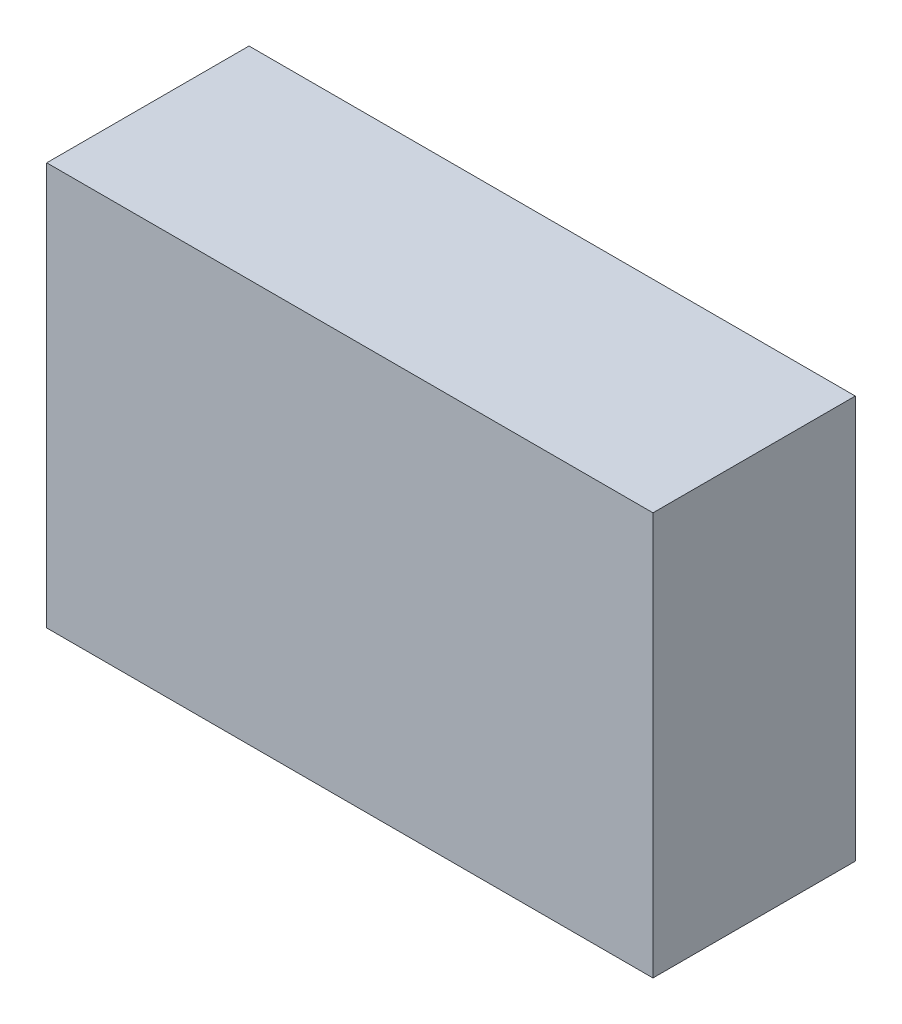
ISO-10303-21;
HEADER;
FILE_DESCRIPTION(('STEP AP214'),'2;1');
FILE_NAME('part.step','',(''),(''),'','','');
FILE_SCHEMA(('AUTOMOTIVE_DESIGN { 1 0 10303 214 1 1 1 1 }'));
ENDSEC;
DATA;
#1=APPLICATION_CONTEXT('core data for automotive mechanical design processes');
#2=APPLICATION_PROTOCOL_DEFINITION('international standard','automotive_design',2000,#1);
#3=PRODUCT_CONTEXT('',#1,'mechanical');
#4=PRODUCT('Part','Part','',(#3));
#5=PRODUCT_RELATED_PRODUCT_CATEGORY('part','',(#4));
#6=PRODUCT_DEFINITION_FORMATION('','',#4);
#7=PRODUCT_DEFINITION_CONTEXT('part definition',#1,'design');
#8=PRODUCT_DEFINITION('design','',#6,#7);
#9=PRODUCT_DEFINITION_SHAPE('','',#8);
#10=(LENGTH_UNIT() NAMED_UNIT(*) SI_UNIT(.MILLI.,.METRE.));
#11=(NAMED_UNIT(*) PLANE_ANGLE_UNIT() SI_UNIT($,.RADIAN.));
#12=(NAMED_UNIT(*) SI_UNIT($,.STERADIAN.) SOLID_ANGLE_UNIT());
#13=UNCERTAINTY_MEASURE_WITH_UNIT(LENGTH_MEASURE(1.E-05),#10,'distance_accuracy_value','');
#14=(GEOMETRIC_REPRESENTATION_CONTEXT(3) GLOBAL_UNCERTAINTY_ASSIGNED_CONTEXT((#13)) GLOBAL_UNIT_ASSIGNED_CONTEXT((#10,
#11,#12)) REPRESENTATION_CONTEXT('',''));
#15=CARTESIAN_POINT('',(0.,0.,0.));
#16=DIRECTION('',(0.,0.,1.));
#17=DIRECTION('',(1.,0.,0.));
#18=AXIS2_PLACEMENT_3D('',#15,#16,#17);
#19=CARTESIAN_POINT('',(-1.4984,-0.983,1.));
#20=DIRECTION('',(1.,0.,0.));
#21=DIRECTION('',(0.,0.,-1.));
#22=AXIS2_PLACEMENT_3D('',#19,#20,#21);
#23=PLANE('',#22);
#24=DIRECTION('',(0.,-1.,0.));
#25=VECTOR('',#24,1.);
#26=CARTESIAN_POINT('',(-1.4984,-0.983,0.));
#27=LINE('',#26,#25);
#28=CARTESIAN_POINT('',(-1.4984,1.0084,0.));
#29=VERTEX_POINT('',#28);
#30=CARTESIAN_POINT('',(-1.4984,-0.983,0.));
#31=VERTEX_POINT('',#30);
#32=EDGE_CURVE('E96',#29,#31,#27,.T.);
#33=ORIENTED_EDGE('',*,*,#32,.T.);
#34=DIRECTION('',(0.,0.,-1.));
#35=VECTOR('',#34,1.);
#36=CARTESIAN_POINT('',(-1.4984,-0.983,1.));
#37=LINE('',#36,#35);
#38=CARTESIAN_POINT('',(-1.4984,-0.983,1.));
#39=VERTEX_POINT('',#38);
#40=EDGE_CURVE('E11',#39,#31,#37,.T.);
#41=ORIENTED_EDGE('',*,*,#40,.F.);
#42=DIRECTION('',(0.,-1.,0.));
#43=VECTOR('',#42,1.);
#44=CARTESIAN_POINT('',(-1.4984,-0.983,1.));
#45=LINE('',#44,#43);
#46=CARTESIAN_POINT('',(-1.4984,1.0084,1.));
#47=VERTEX_POINT('',#46);
#48=EDGE_CURVE('E84',#47,#39,#45,.T.);
#49=ORIENTED_EDGE('',*,*,#48,.F.);
#50=DIRECTION('',(0.,0.,-1.));
#51=VECTOR('',#50,1.);
#52=CARTESIAN_POINT('',(-1.4984,1.0084,1.));
#53=LINE('',#52,#51);
#54=EDGE_CURVE('E92',#47,#29,#53,.T.);
#55=ORIENTED_EDGE('',*,*,#54,.T.);
#56=EDGE_LOOP('',(#33,#41,#49,#55));
#57=FACE_BOUND('',#56,.T.);
#58=ADVANCED_FACE('F33',(#57),#23,.F.);
#59=CARTESIAN_POINT('',(1.4984,-0.983,1.));
#60=DIRECTION('',(0.,1.,0.));
#61=DIRECTION('',(0.,0.,1.));
#62=AXIS2_PLACEMENT_3D('',#59,#60,#61);
#63=PLANE('',#62);
#64=DIRECTION('',(1.,0.,0.));
#65=VECTOR('',#64,1.);
#66=CARTESIAN_POINT('',(1.4984,-0.983,0.));
#67=LINE('',#66,#65);
#68=CARTESIAN_POINT('',(1.4984,-0.983,0.));
#69=VERTEX_POINT('',#68);
#70=EDGE_CURVE('E88',#31,#69,#67,.T.);
#71=ORIENTED_EDGE('',*,*,#70,.T.);
#72=DIRECTION('',(0.,0.,-1.));
#73=VECTOR('',#72,1.);
#74=CARTESIAN_POINT('',(1.4984,-0.983,1.));
#75=LINE('',#74,#73);
#76=CARTESIAN_POINT('',(1.4984,-0.983,1.));
#77=VERTEX_POINT('',#76);
#78=EDGE_CURVE('E41',#77,#69,#75,.T.);
#79=ORIENTED_EDGE('',*,*,#78,.F.);
#80=DIRECTION('',(1.,0.,0.));
#81=VECTOR('',#80,1.);
#82=CARTESIAN_POINT('',(1.4984,-0.983,1.));
#83=LINE('',#82,#81);
#84=EDGE_CURVE('E79',#39,#77,#83,.T.);
#85=ORIENTED_EDGE('',*,*,#84,.F.);
#86=ORIENTED_EDGE('',*,*,#40,.T.);
#87=EDGE_LOOP('',(#71,#79,#85,#86));
#88=FACE_BOUND('',#87,.T.);
#89=ADVANCED_FACE('F87',(#88),#63,.F.);
#90=CARTESIAN_POINT('',(1.4984,1.0084,1.));
#91=DIRECTION('',(-1.,0.,0.));
#92=DIRECTION('',(0.,0.,1.));
#93=AXIS2_PLACEMENT_3D('',#90,#91,#92);
#94=PLANE('',#93);
#95=DIRECTION('',(0.,1.,0.));
#96=VECTOR('',#95,1.);
#97=CARTESIAN_POINT('',(1.4984,1.0084,0.));
#98=LINE('',#97,#96);
#99=CARTESIAN_POINT('',(1.4984,1.0084,0.));
#100=VERTEX_POINT('',#99);
#101=EDGE_CURVE('E66',#69,#100,#98,.T.);
#102=ORIENTED_EDGE('',*,*,#101,.T.);
#103=DIRECTION('',(0.,0.,-1.));
#104=VECTOR('',#103,1.);
#105=CARTESIAN_POINT('',(1.4984,1.0084,1.));
#106=LINE('',#105,#104);
#107=CARTESIAN_POINT('',(1.4984,1.0084,1.));
#108=VERTEX_POINT('',#107);
#109=EDGE_CURVE('E89',#108,#100,#106,.T.);
#110=ORIENTED_EDGE('',*,*,#109,.F.);
#111=DIRECTION('',(0.,1.,0.));
#112=VECTOR('',#111,1.);
#113=CARTESIAN_POINT('',(1.4984,1.0084,1.));
#114=LINE('',#113,#112);
#115=EDGE_CURVE('E82',#77,#108,#114,.T.);
#116=ORIENTED_EDGE('',*,*,#115,.F.);
#117=ORIENTED_EDGE('',*,*,#78,.T.);
#118=EDGE_LOOP('',(#102,#110,#116,#117));
#119=FACE_BOUND('',#118,.T.);
#120=ADVANCED_FACE('F90',(#119),#94,.F.);
#121=CARTESIAN_POINT('',(-1.4984,1.0084,1.));
#122=DIRECTION('',(0.,-1.,0.));
#123=DIRECTION('',(0.,0.,-1.));
#124=AXIS2_PLACEMENT_3D('',#121,#122,#123);
#125=PLANE('',#124);
#126=DIRECTION('',(-1.,0.,0.));
#127=VECTOR('',#126,1.);
#128=CARTESIAN_POINT('',(-1.4984,1.0084,0.));
#129=LINE('',#128,#127);
#130=EDGE_CURVE('E72',#100,#29,#129,.T.);
#131=ORIENTED_EDGE('',*,*,#130,.T.);
#132=ORIENTED_EDGE('',*,*,#54,.F.);
#133=DIRECTION('',(-1.,0.,0.));
#134=VECTOR('',#133,1.);
#135=CARTESIAN_POINT('',(-1.4984,1.0084,1.));
#136=LINE('',#135,#134);
#137=EDGE_CURVE('E49',#108,#47,#136,.T.);
#138=ORIENTED_EDGE('',*,*,#137,.F.);
#139=ORIENTED_EDGE('',*,*,#109,.T.);
#140=EDGE_LOOP('',(#131,#132,#138,#139));
#141=FACE_BOUND('',#140,.T.);
#142=ADVANCED_FACE('F103',(#141),#125,.F.);
#143=CARTESIAN_POINT('',(0.,0.,1.));
#144=DIRECTION('',(0.,0.,-1.));
#145=DIRECTION('',(-1.,0.,0.));
#146=AXIS2_PLACEMENT_3D('',#143,#144,#145);
#147=PLANE('',#146);
#148=ORIENTED_EDGE('',*,*,#48,.T.);
#149=ORIENTED_EDGE('',*,*,#84,.T.);
#150=ORIENTED_EDGE('',*,*,#115,.T.);
#151=ORIENTED_EDGE('',*,*,#137,.T.);
#152=EDGE_LOOP('',(#148,#149,#150,#151));
#153=FACE_BOUND('',#152,.T.);
#154=ADVANCED_FACE('F80',(#153),#147,.F.);
#155=CARTESIAN_POINT('',(0.,0.,0.));
#156=DIRECTION('',(0.,0.,-1.));
#157=DIRECTION('',(-1.,0.,0.));
#158=AXIS2_PLACEMENT_3D('',#155,#156,#157);
#159=PLANE('',#158);
#160=ORIENTED_EDGE('',*,*,#32,.F.);
#161=ORIENTED_EDGE('',*,*,#130,.F.);
#162=ORIENTED_EDGE('',*,*,#101,.F.);
#163=ORIENTED_EDGE('',*,*,#70,.F.);
#164=EDGE_LOOP('',(#160,#161,#162,#163));
#165=FACE_BOUND('',#164,.T.);
#166=ADVANCED_FACE('F106',(#165),#159,.T.);
#167=CLOSED_SHELL('',(#58,#89,#120,#142,#154,#166));
#168=MANIFOLD_SOLID_BREP('B2',#167);
#169=ADVANCED_BREP_SHAPE_REPRESENTATION('',(#18,#168),#14);
#170=SHAPE_DEFINITION_REPRESENTATION(#9,#169);
ENDSEC;
END-ISO-10303-21;
